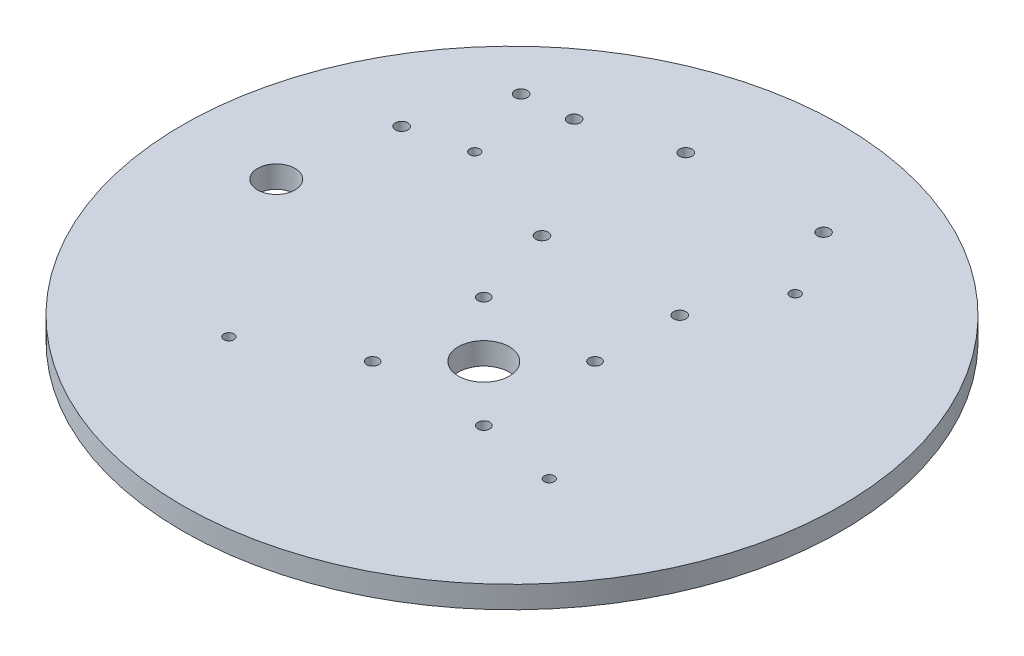
ISO-10303-21;
HEADER;
FILE_DESCRIPTION(('STEP AP214'),'2;1');
FILE_NAME('part.step','',(''),(''),'','','');
FILE_SCHEMA(('AUTOMOTIVE_DESIGN { 1 0 10303 214 1 1 1 1 }'));
ENDSEC;
DATA;
#1=APPLICATION_CONTEXT('core data for automotive mechanical design processes');
#2=APPLICATION_PROTOCOL_DEFINITION('international standard','automotive_design',2000,#1);
#3=PRODUCT_CONTEXT('',#1,'mechanical');
#4=PRODUCT('Part','Part','',(#3));
#5=PRODUCT_RELATED_PRODUCT_CATEGORY('part','',(#4));
#6=PRODUCT_DEFINITION_FORMATION('','',#4);
#7=PRODUCT_DEFINITION_CONTEXT('part definition',#1,'design');
#8=PRODUCT_DEFINITION('design','',#6,#7);
#9=PRODUCT_DEFINITION_SHAPE('','',#8);
#10=(LENGTH_UNIT() NAMED_UNIT(*) SI_UNIT(.MILLI.,.METRE.));
#11=(NAMED_UNIT(*) PLANE_ANGLE_UNIT() SI_UNIT($,.RADIAN.));
#12=(NAMED_UNIT(*) SI_UNIT($,.STERADIAN.) SOLID_ANGLE_UNIT());
#13=UNCERTAINTY_MEASURE_WITH_UNIT(LENGTH_MEASURE(1.E-05),#10,'distance_accuracy_value','');
#14=(GEOMETRIC_REPRESENTATION_CONTEXT(3) GLOBAL_UNCERTAINTY_ASSIGNED_CONTEXT((#13)) GLOBAL_UNIT_ASSIGNED_CONTEXT((#10,
#11,#12)) REPRESENTATION_CONTEXT('',''));
#15=CARTESIAN_POINT('',(0.,0.,0.));
#16=DIRECTION('',(0.,0.,1.));
#17=DIRECTION('',(1.,0.,0.));
#18=AXIS2_PLACEMENT_3D('',#15,#16,#17);
#19=CARTESIAN_POINT('',(0.,-3.,0.));
#20=DIRECTION('',(0.,-1.,0.));
#21=DIRECTION('',(0.,0.,-1.));
#22=AXIS2_PLACEMENT_3D('',#19,#20,#21);
#23=PLANE('',#22);
#24=CARTESIAN_POINT('',(-79.3222983177107,-3.,-83.1746789269192));
#25=DIRECTION('',(0.,-1.,0.));
#26=DIRECTION('',(0.,0.,-1.));
#27=AXIS2_PLACEMENT_3D('',#24,#25,#26);
#28=CIRCLE('',#27,6.12);
#29=CARTESIAN_POINT('',(-79.3222983177107,-3.,-89.2946789269192));
#30=VERTEX_POINT('',#29);
#31=EDGE_CURVE('E176',#30,#30,#28,.T.);
#32=ORIENTED_EDGE('',*,*,#31,.F.);
#33=EDGE_LOOP('',(#32));
#34=FACE_BOUND('',#33,.T.);
#35=CARTESIAN_POINT('',(-92.744292939751,-3.,-45.9541200775911));
#36=DIRECTION('',(0.,-1.,0.));
#37=DIRECTION('',(0.,0.,-1.));
#38=AXIS2_PLACEMENT_3D('',#35,#36,#37);
#39=CIRCLE('',#38,6.12);
#40=CARTESIAN_POINT('',(-92.744292939751,-3.,-52.0741200775911));
#41=VERTEX_POINT('',#40);
#42=EDGE_CURVE('E164',#41,#41,#39,.T.);
#43=ORIENTED_EDGE('',*,*,#42,.F.);
#44=EDGE_LOOP('',(#43));
#45=FACE_BOUND('',#44,.T.);
#46=CARTESIAN_POINT('',(-58.8369868262449,-3.,-85.1557044842463));
#47=DIRECTION('',(0.,-1.,0.));
#48=DIRECTION('',(0.,0.,-1.));
#49=AXIS2_PLACEMENT_3D('',#46,#47,#48);
#50=CIRCLE('',#49,6.11999999999999);
#51=CARTESIAN_POINT('',(-58.8369868262449,-3.,-91.2757044842463));
#52=VERTEX_POINT('',#51);
#53=EDGE_CURVE('E152',#52,#52,#50,.T.);
#54=ORIENTED_EDGE('',*,*,#53,.F.);
#55=EDGE_LOOP('',(#54));
#56=FACE_BOUND('',#55,.T.);
#57=CARTESIAN_POINT('',(35.56,-3.,-96.52));
#58=DIRECTION('',(0.,-1.,0.));
#59=DIRECTION('',(0.,0.,-1.));
#60=AXIS2_PLACEMENT_3D('',#57,#58,#59);
#61=CIRCLE('',#60,5.855);
#62=CARTESIAN_POINT('',(35.56,-3.,-102.375));
#63=VERTEX_POINT('',#62);
#64=EDGE_CURVE('E140',#63,#63,#61,.T.);
#65=ORIENTED_EDGE('',*,*,#64,.F.);
#66=EDGE_LOOP('',(#65));
#67=FACE_BOUND('',#66,.T.);
#68=CARTESIAN_POINT('',(35.56,-3.,-35.56));
#69=DIRECTION('',(0.,-1.,0.));
#70=DIRECTION('',(0.,0.,-1.));
#71=AXIS2_PLACEMENT_3D('',#68,#69,#70);
#72=CIRCLE('',#71,5.855);
#73=CARTESIAN_POINT('',(35.56,-3.,-41.415));
#74=VERTEX_POINT('',#73);
#75=EDGE_CURVE('E128',#74,#74,#72,.T.);
#76=ORIENTED_EDGE('',*,*,#75,.F.);
#77=EDGE_LOOP('',(#76));
#78=FACE_BOUND('',#77,.T.);
#79=CARTESIAN_POINT('',(-22.86,-3.,-35.56));
#80=DIRECTION('',(0.,-1.,0.));
#81=DIRECTION('',(0.,0.,-1.));
#82=AXIS2_PLACEMENT_3D('',#79,#80,#81);
#83=CIRCLE('',#82,5.855);
#84=CARTESIAN_POINT('',(-22.86,-3.,-41.415));
#85=VERTEX_POINT('',#84);
#86=EDGE_CURVE('E116',#85,#85,#83,.T.);
#87=ORIENTED_EDGE('',*,*,#86,.F.);
#88=EDGE_LOOP('',(#87));
#89=FACE_BOUND('',#88,.T.);
#90=CARTESIAN_POINT('',(-22.86,-3.,-96.52));
#91=DIRECTION('',(0.,-1.,0.));
#92=DIRECTION('',(0.,0.,-1.));
#93=AXIS2_PLACEMENT_3D('',#90,#91,#92);
#94=CIRCLE('',#93,5.855);
#95=CARTESIAN_POINT('',(-22.86,-3.,-102.375));
#96=VERTEX_POINT('',#95);
#97=EDGE_CURVE('E104',#96,#96,#94,.T.);
#98=ORIENTED_EDGE('',*,*,#97,.F.);
#99=EDGE_LOOP('',(#98));
#100=FACE_BOUND('',#99,.T.);
#101=CARTESIAN_POINT('',(10.9599733313389,-3.,22.9137291721872));
#102=DIRECTION('',(0.,-1.,0.));
#103=DIRECTION('',(0.,0.,-1.));
#104=AXIS2_PLACEMENT_3D('',#101,#102,#103);
#105=CIRCLE('',#104,10.795);
#106=CARTESIAN_POINT('',(10.9599733313389,-3.,12.1187291721872));
#107=VERTEX_POINT('',#106);
#108=EDGE_CURVE('E73',#107,#107,#105,.T.);
#109=ORIENTED_EDGE('',*,*,#108,.F.);
#110=EDGE_LOOP('',(#109));
#111=FACE_BOUND('',#110,.T.);
#112=CARTESIAN_POINT('',(34.5299733313389,-3.,-0.656270827812819));
#113=DIRECTION('',(0.,1.,0.));
#114=DIRECTION('',(0.,0.,1.));
#115=AXIS2_PLACEMENT_3D('',#112,#113,#114);
#116=CIRCLE('',#115,2.49999999999999);
#117=CARTESIAN_POINT('',(34.5299733313389,-3.,1.84372917218718));
#118=VERTEX_POINT('',#117);
#119=EDGE_CURVE('E72',#118,#118,#116,.T.);
#120=ORIENTED_EDGE('',*,*,#119,.T.);
#121=EDGE_LOOP('',(#120));
#122=FACE_BOUND('',#121,.T.);
#123=CARTESIAN_POINT('',(-12.6100266686612,-3.,-0.656270827812819));
#124=DIRECTION('',(0.,1.,0.));
#125=DIRECTION('',(0.,0.,1.));
#126=AXIS2_PLACEMENT_3D('',#123,#124,#125);
#127=CIRCLE('',#126,2.5);
#128=CARTESIAN_POINT('',(-12.6100266686612,-3.,1.84372917218718));
#129=VERTEX_POINT('',#128);
#130=EDGE_CURVE('E79',#129,#129,#127,.T.);
#131=ORIENTED_EDGE('',*,*,#130,.T.);
#132=EDGE_LOOP('',(#131));
#133=FACE_BOUND('',#132,.T.);
#134=CARTESIAN_POINT('',(-12.6100266686612,-3.,46.4837291721872));
#135=DIRECTION('',(0.,1.,0.));
#136=DIRECTION('',(0.,0.,1.));
#137=AXIS2_PLACEMENT_3D('',#134,#135,#136);
#138=CIRCLE('',#137,2.5);
#139=CARTESIAN_POINT('',(-12.6100266686612,-3.,48.9837291721872));
#140=VERTEX_POINT('',#139);
#141=EDGE_CURVE('E85',#140,#140,#138,.T.);
#142=ORIENTED_EDGE('',*,*,#141,.T.);
#143=EDGE_LOOP('',(#142));
#144=FACE_BOUND('',#143,.T.);
#145=CARTESIAN_POINT('',(34.5299733313389,-3.,46.4837291721872));
#146=DIRECTION('',(0.,1.,0.));
#147=DIRECTION('',(0.,0.,1.));
#148=AXIS2_PLACEMENT_3D('',#145,#146,#147);
#149=CIRCLE('',#148,2.5);
#150=CARTESIAN_POINT('',(34.5299733313389,-3.,48.9837291721872));
#151=VERTEX_POINT('',#150);
#152=EDGE_CURVE('E68',#151,#151,#149,.T.);
#153=ORIENTED_EDGE('',*,*,#152,.T.);
#154=EDGE_LOOP('',(#153));
#155=FACE_BOUND('',#154,.T.);
#156=CARTESIAN_POINT('',(-99.9143296030154,-3.,0.));
#157=DIRECTION('',(0.,1.,0.));
#158=DIRECTION('',(0.,0.,1.));
#159=AXIS2_PLACEMENT_3D('',#156,#157,#158);
#160=CIRCLE('',#159,7.9375);
#161=CARTESIAN_POINT('',(-99.9143296030154,-3.,7.9375));
#162=VERTEX_POINT('',#161);
#163=EDGE_CURVE('E59',#162,#162,#160,.T.);
#164=ORIENTED_EDGE('',*,*,#163,.T.);
#165=EDGE_LOOP('',(#164));
#166=FACE_BOUND('',#165,.T.);
#167=CARTESIAN_POINT('',(67.9108883435695,-3.,52.1098574036457));
#168=DIRECTION('',(0.,1.,0.));
#169=DIRECTION('',(0.,0.,1.));
#170=AXIS2_PLACEMENT_3D('',#167,#168,#169);
#171=CIRCLE('',#170,2.15);
#172=CARTESIAN_POINT('',(67.9108883435695,-3.,54.2598574036457));
#173=VERTEX_POINT('',#172);
#174=EDGE_CURVE('E56',#173,#173,#171,.T.);
#175=ORIENTED_EDGE('',*,*,#174,.T.);
#176=EDGE_LOOP('',(#175));
#177=FACE_BOUND('',#176,.T.);
#178=CARTESIAN_POINT('',(-52.1098574036464,-3.,67.910888343569));
#179=DIRECTION('',(0.,1.,0.));
#180=DIRECTION('',(0.,0.,1.));
#181=AXIS2_PLACEMENT_3D('',#178,#179,#180);
#182=CIRCLE('',#181,2.15);
#183=CARTESIAN_POINT('',(-52.1098574036464,-3.,70.060888343569));
#184=VERTEX_POINT('',#183);
#185=EDGE_CURVE('E51',#184,#184,#182,.T.);
#186=ORIENTED_EDGE('',*,*,#185,.T.);
#187=EDGE_LOOP('',(#186));
#188=FACE_BOUND('',#187,.T.);
#189=CARTESIAN_POINT('',(-67.9108883435691,-3.,-52.1098574036462));
#190=DIRECTION('',(0.,1.,0.));
#191=DIRECTION('',(0.,0.,1.));
#192=AXIS2_PLACEMENT_3D('',#189,#190,#191);
#193=CIRCLE('',#192,2.15);
#194=CARTESIAN_POINT('',(-67.9108883435691,-3.,-49.9598574036462));
#195=VERTEX_POINT('',#194);
#196=EDGE_CURVE('E47',#195,#195,#193,.T.);
#197=ORIENTED_EDGE('',*,*,#196,.T.);
#198=EDGE_LOOP('',(#197));
#199=FACE_BOUND('',#198,.T.);
#200=CARTESIAN_POINT('',(52.1098574036464,-3.,-67.910888343569));
#201=DIRECTION('',(0.,1.,0.));
#202=DIRECTION('',(0.,0.,1.));
#203=AXIS2_PLACEMENT_3D('',#200,#201,#202);
#204=CIRCLE('',#203,2.15);
#205=CARTESIAN_POINT('',(52.1098574036464,-3.,-65.760888343569));
#206=VERTEX_POINT('',#205);
#207=EDGE_CURVE('E43',#206,#206,#204,.T.);
#208=ORIENTED_EDGE('',*,*,#207,.T.);
#209=EDGE_LOOP('',(#208));
#210=FACE_BOUND('',#209,.T.);
#211=CARTESIAN_POINT('',(0.,-3.,0.));
#212=DIRECTION('',(0.,-1.,0.));
#213=DIRECTION('',(0.,0.,-1.));
#214=AXIS2_PLACEMENT_3D('',#211,#212,#213);
#215=CIRCLE('',#214,139.7);
#216=CARTESIAN_POINT('',(0.,-3.,-139.7));
#217=VERTEX_POINT('',#216);
#218=EDGE_CURVE('E65',#217,#217,#215,.T.);
#219=ORIENTED_EDGE('',*,*,#218,.T.);
#220=EDGE_LOOP('',(#219));
#221=FACE_BOUND('',#220,.T.);
#222=ADVANCED_FACE('F36',(#34,#45,#56,#67,#78,#89,#100,#111,#122,#133,#144,#155,#166,#177,#188,
#199,#210,#221),#23,.T.);
#223=CARTESIAN_POINT('',(0.,6.35,0.));
#224=DIRECTION('',(0.,1.,0.));
#225=DIRECTION('',(0.,0.,1.));
#226=AXIS2_PLACEMENT_3D('',#223,#224,#225);
#227=PLANE('',#226);
#228=CARTESIAN_POINT('',(-79.3222983177107,6.35,-83.1746789269192));
#229=DIRECTION('',(0.,-1.,0.));
#230=DIRECTION('',(0.,0.,-1.));
#231=AXIS2_PLACEMENT_3D('',#228,#229,#230);
#232=CIRCLE('',#231,2.65);
#233=CARTESIAN_POINT('',(-79.3222983177107,6.35,-85.8246789269192));
#234=VERTEX_POINT('',#233);
#235=EDGE_CURVE('E167',#234,#234,#232,.T.);
#236=ORIENTED_EDGE('',*,*,#235,.T.);
#237=EDGE_LOOP('',(#236));
#238=FACE_BOUND('',#237,.T.);
#239=CARTESIAN_POINT('',(-92.744292939751,6.35,-45.9541200775911));
#240=DIRECTION('',(0.,-1.,0.));
#241=DIRECTION('',(0.,0.,-1.));
#242=AXIS2_PLACEMENT_3D('',#239,#240,#241);
#243=CIRCLE('',#242,2.65);
#244=CARTESIAN_POINT('',(-92.744292939751,6.35,-48.6041200775911));
#245=VERTEX_POINT('',#244);
#246=EDGE_CURVE('E155',#245,#245,#243,.T.);
#247=ORIENTED_EDGE('',*,*,#246,.T.);
#248=EDGE_LOOP('',(#247));
#249=FACE_BOUND('',#248,.T.);
#250=CARTESIAN_POINT('',(-58.8369868262449,6.35,-85.1557044842463));
#251=DIRECTION('',(0.,-1.,0.));
#252=DIRECTION('',(0.,0.,-1.));
#253=AXIS2_PLACEMENT_3D('',#250,#251,#252);
#254=CIRCLE('',#253,2.65);
#255=CARTESIAN_POINT('',(-58.8369868262449,6.35,-87.8057044842463));
#256=VERTEX_POINT('',#255);
#257=EDGE_CURVE('E143',#256,#256,#254,.T.);
#258=ORIENTED_EDGE('',*,*,#257,.T.);
#259=EDGE_LOOP('',(#258));
#260=FACE_BOUND('',#259,.T.);
#261=CARTESIAN_POINT('',(35.56,6.35,-96.52));
#262=DIRECTION('',(0.,-1.,0.));
#263=DIRECTION('',(0.,0.,-1.));
#264=AXIS2_PLACEMENT_3D('',#261,#262,#263);
#265=CIRCLE('',#264,2.65);
#266=CARTESIAN_POINT('',(35.56,6.35,-99.17));
#267=VERTEX_POINT('',#266);
#268=EDGE_CURVE('E131',#267,#267,#265,.T.);
#269=ORIENTED_EDGE('',*,*,#268,.T.);
#270=EDGE_LOOP('',(#269));
#271=FACE_BOUND('',#270,.T.);
#272=CARTESIAN_POINT('',(35.56,6.35,-35.56));
#273=DIRECTION('',(0.,-1.,0.));
#274=DIRECTION('',(0.,0.,-1.));
#275=AXIS2_PLACEMENT_3D('',#272,#273,#274);
#276=CIRCLE('',#275,2.65);
#277=CARTESIAN_POINT('',(35.56,6.35,-38.21));
#278=VERTEX_POINT('',#277);
#279=EDGE_CURVE('E119',#278,#278,#276,.T.);
#280=ORIENTED_EDGE('',*,*,#279,.T.);
#281=EDGE_LOOP('',(#280));
#282=FACE_BOUND('',#281,.T.);
#283=CARTESIAN_POINT('',(-22.86,6.35,-35.56));
#284=DIRECTION('',(0.,-1.,0.));
#285=DIRECTION('',(0.,0.,-1.));
#286=AXIS2_PLACEMENT_3D('',#283,#284,#285);
#287=CIRCLE('',#286,2.65);
#288=CARTESIAN_POINT('',(-22.86,6.35,-38.21));
#289=VERTEX_POINT('',#288);
#290=EDGE_CURVE('E107',#289,#289,#287,.T.);
#291=ORIENTED_EDGE('',*,*,#290,.T.);
#292=EDGE_LOOP('',(#291));
#293=FACE_BOUND('',#292,.T.);
#294=CARTESIAN_POINT('',(-22.86,6.35,-96.52));
#295=DIRECTION('',(0.,-1.,0.));
#296=DIRECTION('',(0.,0.,-1.));
#297=AXIS2_PLACEMENT_3D('',#294,#295,#296);
#298=CIRCLE('',#297,2.65);
#299=CARTESIAN_POINT('',(-22.86,6.35,-99.17));
#300=VERTEX_POINT('',#299);
#301=EDGE_CURVE('E95',#300,#300,#298,.T.);
#302=ORIENTED_EDGE('',*,*,#301,.T.);
#303=EDGE_LOOP('',(#302));
#304=FACE_BOUND('',#303,.T.);
#305=CARTESIAN_POINT('',(34.5299733313389,6.35,-0.656270827812819));
#306=DIRECTION('',(0.,1.,0.));
#307=DIRECTION('',(0.,0.,1.));
#308=AXIS2_PLACEMENT_3D('',#305,#306,#307);
#309=CIRCLE('',#308,2.49999999999999);
#310=CARTESIAN_POINT('',(34.5299733313389,6.35,1.84372917218718));
#311=VERTEX_POINT('',#310);
#312=EDGE_CURVE('E69',#311,#311,#309,.T.);
#313=ORIENTED_EDGE('',*,*,#312,.F.);
#314=EDGE_LOOP('',(#313));
#315=FACE_BOUND('',#314,.T.);
#316=CARTESIAN_POINT('',(-12.6100266686612,6.35,-0.656270827812819));
#317=DIRECTION('',(0.,1.,0.));
#318=DIRECTION('',(0.,0.,1.));
#319=AXIS2_PLACEMENT_3D('',#316,#317,#318);
#320=CIRCLE('',#319,2.5);
#321=CARTESIAN_POINT('',(-12.6100266686612,6.35,1.84372917218718));
#322=VERTEX_POINT('',#321);
#323=EDGE_CURVE('E76',#322,#322,#320,.T.);
#324=ORIENTED_EDGE('',*,*,#323,.F.);
#325=EDGE_LOOP('',(#324));
#326=FACE_BOUND('',#325,.T.);
#327=CARTESIAN_POINT('',(-12.6100266686612,6.35,46.4837291721872));
#328=DIRECTION('',(0.,1.,0.));
#329=DIRECTION('',(0.,0.,1.));
#330=AXIS2_PLACEMENT_3D('',#327,#328,#329);
#331=CIRCLE('',#330,2.5);
#332=CARTESIAN_POINT('',(-12.6100266686612,6.35,48.9837291721872));
#333=VERTEX_POINT('',#332);
#334=EDGE_CURVE('E82',#333,#333,#331,.T.);
#335=ORIENTED_EDGE('',*,*,#334,.F.);
#336=EDGE_LOOP('',(#335));
#337=FACE_BOUND('',#336,.T.);
#338=CARTESIAN_POINT('',(34.5299733313389,6.35,46.4837291721872));
#339=DIRECTION('',(0.,1.,0.));
#340=DIRECTION('',(0.,0.,1.));
#341=AXIS2_PLACEMENT_3D('',#338,#339,#340);
#342=CIRCLE('',#341,2.5);
#343=CARTESIAN_POINT('',(34.5299733313389,6.35,48.9837291721872));
#344=VERTEX_POINT('',#343);
#345=EDGE_CURVE('E88',#344,#344,#342,.T.);
#346=ORIENTED_EDGE('',*,*,#345,.F.);
#347=EDGE_LOOP('',(#346));
#348=FACE_BOUND('',#347,.T.);
#349=CARTESIAN_POINT('',(-99.9143296030154,6.35,0.));
#350=DIRECTION('',(0.,1.,0.));
#351=DIRECTION('',(0.,0.,1.));
#352=AXIS2_PLACEMENT_3D('',#349,#350,#351);
#353=CIRCLE('',#352,7.9375);
#354=CARTESIAN_POINT('',(-99.9143296030154,6.35,7.9375));
#355=VERTEX_POINT('',#354);
#356=EDGE_CURVE('E62',#355,#355,#353,.T.);
#357=ORIENTED_EDGE('',*,*,#356,.F.);
#358=EDGE_LOOP('',(#357));
#359=FACE_BOUND('',#358,.T.);
#360=CARTESIAN_POINT('',(0.,6.35,0.));
#361=DIRECTION('',(0.,1.,0.));
#362=DIRECTION('',(0.,0.,1.));
#363=AXIS2_PLACEMENT_3D('',#360,#361,#362);
#364=CIRCLE('',#363,139.7);
#365=CARTESIAN_POINT('',(0.,6.35,139.7));
#366=VERTEX_POINT('',#365);
#367=EDGE_CURVE('E10',#366,#366,#364,.T.);
#368=ORIENTED_EDGE('',*,*,#367,.T.);
#369=EDGE_LOOP('',(#368));
#370=FACE_BOUND('',#369,.T.);
#371=CARTESIAN_POINT('',(-52.1098574036464,6.35,67.910888343569));
#372=DIRECTION('',(0.,1.,0.));
#373=DIRECTION('',(0.,0.,1.));
#374=AXIS2_PLACEMENT_3D('',#371,#372,#373);
#375=CIRCLE('',#374,2.15);
#376=CARTESIAN_POINT('',(-52.1098574036464,6.35,70.060888343569));
#377=VERTEX_POINT('',#376);
#378=EDGE_CURVE('E179',#377,#377,#375,.T.);
#379=ORIENTED_EDGE('',*,*,#378,.F.);
#380=EDGE_LOOP('',(#379));
#381=FACE_BOUND('',#380,.T.);
#382=CARTESIAN_POINT('',(67.9108883435695,6.35,52.1098574036457));
#383=DIRECTION('',(0.,1.,0.));
#384=DIRECTION('',(0.,0.,1.));
#385=AXIS2_PLACEMENT_3D('',#382,#383,#384);
#386=CIRCLE('',#385,2.15);
#387=CARTESIAN_POINT('',(67.9108883435695,6.35,54.2598574036457));
#388=VERTEX_POINT('',#387);
#389=EDGE_CURVE('E182',#388,#388,#386,.T.);
#390=ORIENTED_EDGE('',*,*,#389,.F.);
#391=EDGE_LOOP('',(#390));
#392=FACE_BOUND('',#391,.T.);
#393=CARTESIAN_POINT('',(10.9599733313389,6.35,22.9137291721872));
#394=DIRECTION('',(0.,1.,0.));
#395=DIRECTION('',(0.,0.,1.));
#396=AXIS2_PLACEMENT_3D('',#393,#394,#395);
#397=CIRCLE('',#396,10.795);
#398=CARTESIAN_POINT('',(10.9599733313389,6.35,33.7087291721872));
#399=VERTEX_POINT('',#398);
#400=EDGE_CURVE('E185',#399,#399,#397,.T.);
#401=ORIENTED_EDGE('',*,*,#400,.F.);
#402=EDGE_LOOP('',(#401));
#403=FACE_BOUND('',#402,.T.);
#404=CARTESIAN_POINT('',(52.1098574036464,6.35,-67.910888343569));
#405=DIRECTION('',(0.,1.,0.));
#406=DIRECTION('',(0.,0.,1.));
#407=AXIS2_PLACEMENT_3D('',#404,#405,#406);
#408=CIRCLE('',#407,2.15);
#409=CARTESIAN_POINT('',(52.1098574036464,6.35,-65.760888343569));
#410=VERTEX_POINT('',#409);
#411=EDGE_CURVE('E188',#410,#410,#408,.T.);
#412=ORIENTED_EDGE('',*,*,#411,.F.);
#413=EDGE_LOOP('',(#412));
#414=FACE_BOUND('',#413,.T.);
#415=CARTESIAN_POINT('',(-67.9108883435691,6.35,-52.1098574036462));
#416=DIRECTION('',(0.,1.,0.));
#417=DIRECTION('',(0.,0.,1.));
#418=AXIS2_PLACEMENT_3D('',#415,#416,#417);
#419=CIRCLE('',#418,2.15);
#420=CARTESIAN_POINT('',(-67.9108883435691,6.35,-49.9598574036462));
#421=VERTEX_POINT('',#420);
#422=EDGE_CURVE('E191',#421,#421,#419,.T.);
#423=ORIENTED_EDGE('',*,*,#422,.F.);
#424=EDGE_LOOP('',(#423));
#425=FACE_BOUND('',#424,.T.);
#426=ADVANCED_FACE('F197',(#238,#249,#260,#271,#282,#293,#304,#315,#326,#337,#348,#359,#370,
#381,#392,#403,#414,#425),#227,.T.);
#427=CARTESIAN_POINT('',(0.,6.35,0.));
#428=DIRECTION('',(0.,-1.,0.));
#429=DIRECTION('',(0.,0.,-1.));
#430=AXIS2_PLACEMENT_3D('',#427,#428,#429);
#431=CYLINDRICAL_SURFACE('',#430,139.7);
#432=ORIENTED_EDGE('',*,*,#367,.F.);
#433=EDGE_LOOP('',(#432));
#434=FACE_BOUND('',#433,.T.);
#435=ORIENTED_EDGE('',*,*,#218,.F.);
#436=EDGE_LOOP('',(#435));
#437=FACE_BOUND('',#436,.T.);
#438=ADVANCED_FACE('F38',(#434,#437),#431,.T.);
#439=CARTESIAN_POINT('',(52.1098574036464,6.35,-67.910888343569));
#440=DIRECTION('',(0.,1.,0.));
#441=DIRECTION('',(0.,0.,1.));
#442=AXIS2_PLACEMENT_3D('',#439,#440,#441);
#443=CYLINDRICAL_SURFACE('',#442,2.15);
#444=ORIENTED_EDGE('',*,*,#207,.F.);
#445=EDGE_LOOP('',(#444));
#446=FACE_BOUND('',#445,.T.);
#447=ORIENTED_EDGE('',*,*,#411,.T.);
#448=EDGE_LOOP('',(#447));
#449=FACE_BOUND('',#448,.T.);
#450=ADVANCED_FACE('F204',(#446,#449),#443,.F.);
#451=CARTESIAN_POINT('',(-67.9108883435691,6.35,-52.1098574036462));
#452=DIRECTION('',(0.,1.,0.));
#453=DIRECTION('',(0.,0.,1.));
#454=AXIS2_PLACEMENT_3D('',#451,#452,#453);
#455=CYLINDRICAL_SURFACE('',#454,2.15);
#456=ORIENTED_EDGE('',*,*,#196,.F.);
#457=EDGE_LOOP('',(#456));
#458=FACE_BOUND('',#457,.T.);
#459=ORIENTED_EDGE('',*,*,#422,.T.);
#460=EDGE_LOOP('',(#459));
#461=FACE_BOUND('',#460,.T.);
#462=ADVANCED_FACE('F195',(#458,#461),#455,.F.);
#463=CARTESIAN_POINT('',(-52.1098574036464,6.35,67.910888343569));
#464=DIRECTION('',(0.,1.,0.));
#465=DIRECTION('',(0.,0.,1.));
#466=AXIS2_PLACEMENT_3D('',#463,#464,#465);
#467=CYLINDRICAL_SURFACE('',#466,2.15);
#468=ORIENTED_EDGE('',*,*,#185,.F.);
#469=EDGE_LOOP('',(#468));
#470=FACE_BOUND('',#469,.T.);
#471=ORIENTED_EDGE('',*,*,#378,.T.);
#472=EDGE_LOOP('',(#471));
#473=FACE_BOUND('',#472,.T.);
#474=ADVANCED_FACE('F215',(#470,#473),#467,.F.);
#475=CARTESIAN_POINT('',(67.9108883435695,6.35,52.1098574036457));
#476=DIRECTION('',(0.,1.,0.));
#477=DIRECTION('',(0.,0.,1.));
#478=AXIS2_PLACEMENT_3D('',#475,#476,#477);
#479=CYLINDRICAL_SURFACE('',#478,2.15);
#480=ORIENTED_EDGE('',*,*,#174,.F.);
#481=EDGE_LOOP('',(#480));
#482=FACE_BOUND('',#481,.T.);
#483=ORIENTED_EDGE('',*,*,#389,.T.);
#484=EDGE_LOOP('',(#483));
#485=FACE_BOUND('',#484,.T.);
#486=ADVANCED_FACE('F219',(#482,#485),#479,.F.);
#487=CARTESIAN_POINT('',(-99.9143296030154,6.35,0.));
#488=DIRECTION('',(0.,1.,0.));
#489=DIRECTION('',(0.,0.,1.));
#490=AXIS2_PLACEMENT_3D('',#487,#488,#489);
#491=CYLINDRICAL_SURFACE('',#490,7.9375);
#492=ORIENTED_EDGE('',*,*,#163,.F.);
#493=EDGE_LOOP('',(#492));
#494=FACE_BOUND('',#493,.T.);
#495=ORIENTED_EDGE('',*,*,#356,.T.);
#496=EDGE_LOOP('',(#495));
#497=FACE_BOUND('',#496,.T.);
#498=ADVANCED_FACE('F223',(#494,#497),#491,.F.);
#499=CARTESIAN_POINT('',(34.5299733313389,-3.,46.4837291721872));
#500=DIRECTION('',(0.,1.,0.));
#501=DIRECTION('',(0.,0.,1.));
#502=AXIS2_PLACEMENT_3D('',#499,#500,#501);
#503=CYLINDRICAL_SURFACE('',#502,2.5);
#504=ORIENTED_EDGE('',*,*,#152,.F.);
#505=EDGE_LOOP('',(#504));
#506=FACE_BOUND('',#505,.T.);
#507=ORIENTED_EDGE('',*,*,#345,.T.);
#508=EDGE_LOOP('',(#507));
#509=FACE_BOUND('',#508,.T.);
#510=ADVANCED_FACE('F227',(#506,#509),#503,.F.);
#511=CARTESIAN_POINT('',(-12.6100266686612,-3.,46.4837291721872));
#512=DIRECTION('',(0.,1.,0.));
#513=DIRECTION('',(0.,0.,1.));
#514=AXIS2_PLACEMENT_3D('',#511,#512,#513);
#515=CYLINDRICAL_SURFACE('',#514,2.5);
#516=ORIENTED_EDGE('',*,*,#141,.F.);
#517=EDGE_LOOP('',(#516));
#518=FACE_BOUND('',#517,.T.);
#519=ORIENTED_EDGE('',*,*,#334,.T.);
#520=EDGE_LOOP('',(#519));
#521=FACE_BOUND('',#520,.T.);
#522=ADVANCED_FACE('F237',(#518,#521),#515,.F.);
#523=CARTESIAN_POINT('',(-12.6100266686612,-3.,-0.656270827812819));
#524=DIRECTION('',(0.,1.,0.));
#525=DIRECTION('',(0.,0.,1.));
#526=AXIS2_PLACEMENT_3D('',#523,#524,#525);
#527=CYLINDRICAL_SURFACE('',#526,2.5);
#528=ORIENTED_EDGE('',*,*,#130,.F.);
#529=EDGE_LOOP('',(#528));
#530=FACE_BOUND('',#529,.T.);
#531=ORIENTED_EDGE('',*,*,#323,.T.);
#532=EDGE_LOOP('',(#531));
#533=FACE_BOUND('',#532,.T.);
#534=ADVANCED_FACE('F233',(#530,#533),#527,.F.);
#535=CARTESIAN_POINT('',(34.5299733313389,-3.,-0.656270827812819));
#536=DIRECTION('',(0.,1.,0.));
#537=DIRECTION('',(0.,0.,1.));
#538=AXIS2_PLACEMENT_3D('',#535,#536,#537);
#539=CYLINDRICAL_SURFACE('',#538,2.49999999999999);
#540=ORIENTED_EDGE('',*,*,#119,.F.);
#541=EDGE_LOOP('',(#540));
#542=FACE_BOUND('',#541,.T.);
#543=ORIENTED_EDGE('',*,*,#312,.T.);
#544=EDGE_LOOP('',(#543));
#545=FACE_BOUND('',#544,.T.);
#546=ADVANCED_FACE('F229',(#542,#545),#539,.F.);
#547=CARTESIAN_POINT('',(10.9599733313389,6.35,22.9137291721872));
#548=DIRECTION('',(0.,-1.,0.));
#549=DIRECTION('',(0.,0.,-1.));
#550=AXIS2_PLACEMENT_3D('',#547,#548,#549);
#551=CYLINDRICAL_SURFACE('',#550,10.795);
#552=ORIENTED_EDGE('',*,*,#108,.T.);
#553=EDGE_LOOP('',(#552));
#554=FACE_BOUND('',#553,.T.);
#555=ORIENTED_EDGE('',*,*,#400,.T.);
#556=EDGE_LOOP('',(#555));
#557=FACE_BOUND('',#556,.T.);
#558=ADVANCED_FACE('F232',(#554,#557),#551,.F.);
#559=CARTESIAN_POINT('',(-22.86,-3.,-96.52));
#560=DIRECTION('',(0.,-1.,0.));
#561=DIRECTION('',(0.,0.,-1.));
#562=AXIS2_PLACEMENT_3D('',#559,#560,#561);
#563=CYLINDRICAL_SURFACE('',#562,2.65);
#564=ORIENTED_EDGE('',*,*,#301,.F.);
#565=EDGE_LOOP('',(#564));
#566=FACE_BOUND('',#565,.T.);
#567=CARTESIAN_POINT('',(-22.86,0.799999999999999,-96.52));
#568=DIRECTION('',(0.,-1.,0.));
#569=DIRECTION('',(0.,0.,-1.));
#570=AXIS2_PLACEMENT_3D('',#567,#568,#569);
#571=CIRCLE('',#570,2.65);
#572=CARTESIAN_POINT('',(-22.86,0.799999999999999,-99.17));
#573=VERTEX_POINT('',#572);
#574=EDGE_CURVE('E98',#573,#573,#571,.T.);
#575=ORIENTED_EDGE('',*,*,#574,.T.);
#576=EDGE_LOOP('',(#575));
#577=FACE_BOUND('',#576,.T.);
#578=ADVANCED_FACE('F247',(#566,#577),#563,.F.);
#579=CARTESIAN_POINT('',(-20.21,0.8,-96.52));
#580=DIRECTION('',(0.,1.,0.));
#581=DIRECTION('',(0.,0.,1.));
#582=AXIS2_PLACEMENT_3D('',#579,#580,#581);
#583=PLANE('',#582);
#584=ORIENTED_EDGE('',*,*,#574,.F.);
#585=EDGE_LOOP('',(#584));
#586=FACE_BOUND('',#585,.T.);
#587=CARTESIAN_POINT('',(-22.86,0.800000000000001,-96.52));
#588=DIRECTION('',(0.,-1.,0.));
#589=DIRECTION('',(0.,0.,-1.));
#590=AXIS2_PLACEMENT_3D('',#587,#588,#589);
#591=CIRCLE('',#590,5.855);
#592=CARTESIAN_POINT('',(-22.86,0.800000000000001,-102.375));
#593=VERTEX_POINT('',#592);
#594=EDGE_CURVE('E101',#593,#593,#591,.T.);
#595=ORIENTED_EDGE('',*,*,#594,.T.);
#596=EDGE_LOOP('',(#595));
#597=FACE_BOUND('',#596,.T.);
#598=ADVANCED_FACE('F251',(#586,#597),#583,.F.);
#599=CARTESIAN_POINT('',(-22.86,-3.,-96.52));
#600=DIRECTION('',(0.,-1.,0.));
#601=DIRECTION('',(0.,0.,-1.));
#602=AXIS2_PLACEMENT_3D('',#599,#600,#601);
#603=CYLINDRICAL_SURFACE('',#602,5.855);
#604=ORIENTED_EDGE('',*,*,#594,.F.);
#605=EDGE_LOOP('',(#604));
#606=FACE_BOUND('',#605,.T.);
#607=ORIENTED_EDGE('',*,*,#97,.T.);
#608=EDGE_LOOP('',(#607));
#609=FACE_BOUND('',#608,.T.);
#610=ADVANCED_FACE('F255',(#606,#609),#603,.F.);
#611=CARTESIAN_POINT('',(-22.86,-3.,-35.56));
#612=DIRECTION('',(0.,-1.,0.));
#613=DIRECTION('',(0.,0.,-1.));
#614=AXIS2_PLACEMENT_3D('',#611,#612,#613);
#615=CYLINDRICAL_SURFACE('',#614,2.65);
#616=ORIENTED_EDGE('',*,*,#290,.F.);
#617=EDGE_LOOP('',(#616));
#618=FACE_BOUND('',#617,.T.);
#619=CARTESIAN_POINT('',(-22.86,0.799999999999999,-35.56));
#620=DIRECTION('',(0.,-1.,0.));
#621=DIRECTION('',(0.,0.,-1.));
#622=AXIS2_PLACEMENT_3D('',#619,#620,#621);
#623=CIRCLE('',#622,2.65);
#624=CARTESIAN_POINT('',(-22.86,0.799999999999999,-38.21));
#625=VERTEX_POINT('',#624);
#626=EDGE_CURVE('E110',#625,#625,#623,.T.);
#627=ORIENTED_EDGE('',*,*,#626,.T.);
#628=EDGE_LOOP('',(#627));
#629=FACE_BOUND('',#628,.T.);
#630=ADVANCED_FACE('F259',(#618,#629),#615,.F.);
#631=CARTESIAN_POINT('',(-20.21,0.8,-35.56));
#632=DIRECTION('',(0.,1.,0.));
#633=DIRECTION('',(0.,0.,1.));
#634=AXIS2_PLACEMENT_3D('',#631,#632,#633);
#635=PLANE('',#634);
#636=ORIENTED_EDGE('',*,*,#626,.F.);
#637=EDGE_LOOP('',(#636));
#638=FACE_BOUND('',#637,.T.);
#639=CARTESIAN_POINT('',(-22.86,0.800000000000001,-35.56));
#640=DIRECTION('',(0.,-1.,0.));
#641=DIRECTION('',(0.,0.,-1.));
#642=AXIS2_PLACEMENT_3D('',#639,#640,#641);
#643=CIRCLE('',#642,5.855);
#644=CARTESIAN_POINT('',(-22.86,0.800000000000001,-41.415));
#645=VERTEX_POINT('',#644);
#646=EDGE_CURVE('E113',#645,#645,#643,.T.);
#647=ORIENTED_EDGE('',*,*,#646,.T.);
#648=EDGE_LOOP('',(#647));
#649=FACE_BOUND('',#648,.T.);
#650=ADVANCED_FACE('F263',(#638,#649),#635,.F.);
#651=CARTESIAN_POINT('',(-22.86,-3.,-35.56));
#652=DIRECTION('',(0.,-1.,0.));
#653=DIRECTION('',(0.,0.,-1.));
#654=AXIS2_PLACEMENT_3D('',#651,#652,#653);
#655=CYLINDRICAL_SURFACE('',#654,5.855);
#656=ORIENTED_EDGE('',*,*,#646,.F.);
#657=EDGE_LOOP('',(#656));
#658=FACE_BOUND('',#657,.T.);
#659=ORIENTED_EDGE('',*,*,#86,.T.);
#660=EDGE_LOOP('',(#659));
#661=FACE_BOUND('',#660,.T.);
#662=ADVANCED_FACE('F267',(#658,#661),#655,.F.);
#663=CARTESIAN_POINT('',(35.56,-3.,-35.56));
#664=DIRECTION('',(0.,-1.,0.));
#665=DIRECTION('',(0.,0.,-1.));
#666=AXIS2_PLACEMENT_3D('',#663,#664,#665);
#667=CYLINDRICAL_SURFACE('',#666,2.65);
#668=ORIENTED_EDGE('',*,*,#279,.F.);
#669=EDGE_LOOP('',(#668));
#670=FACE_BOUND('',#669,.T.);
#671=CARTESIAN_POINT('',(35.56,0.799999999999999,-35.56));
#672=DIRECTION('',(0.,-1.,0.));
#673=DIRECTION('',(0.,0.,-1.));
#674=AXIS2_PLACEMENT_3D('',#671,#672,#673);
#675=CIRCLE('',#674,2.65);
#676=CARTESIAN_POINT('',(35.56,0.799999999999999,-38.21));
#677=VERTEX_POINT('',#676);
#678=EDGE_CURVE('E122',#677,#677,#675,.T.);
#679=ORIENTED_EDGE('',*,*,#678,.T.);
#680=EDGE_LOOP('',(#679));
#681=FACE_BOUND('',#680,.T.);
#682=ADVANCED_FACE('F271',(#670,#681),#667,.F.);
#683=CARTESIAN_POINT('',(38.21,0.8,-35.56));
#684=DIRECTION('',(0.,1.,0.));
#685=DIRECTION('',(0.,0.,1.));
#686=AXIS2_PLACEMENT_3D('',#683,#684,#685);
#687=PLANE('',#686);
#688=ORIENTED_EDGE('',*,*,#678,.F.);
#689=EDGE_LOOP('',(#688));
#690=FACE_BOUND('',#689,.T.);
#691=CARTESIAN_POINT('',(35.56,0.800000000000001,-35.56));
#692=DIRECTION('',(0.,-1.,0.));
#693=DIRECTION('',(0.,0.,-1.));
#694=AXIS2_PLACEMENT_3D('',#691,#692,#693);
#695=CIRCLE('',#694,5.855);
#696=CARTESIAN_POINT('',(35.56,0.800000000000001,-41.415));
#697=VERTEX_POINT('',#696);
#698=EDGE_CURVE('E125',#697,#697,#695,.T.);
#699=ORIENTED_EDGE('',*,*,#698,.T.);
#700=EDGE_LOOP('',(#699));
#701=FACE_BOUND('',#700,.T.);
#702=ADVANCED_FACE('F275',(#690,#701),#687,.F.);
#703=CARTESIAN_POINT('',(35.56,-3.,-35.56));
#704=DIRECTION('',(0.,-1.,0.));
#705=DIRECTION('',(0.,0.,-1.));
#706=AXIS2_PLACEMENT_3D('',#703,#704,#705);
#707=CYLINDRICAL_SURFACE('',#706,5.855);
#708=ORIENTED_EDGE('',*,*,#698,.F.);
#709=EDGE_LOOP('',(#708));
#710=FACE_BOUND('',#709,.T.);
#711=ORIENTED_EDGE('',*,*,#75,.T.);
#712=EDGE_LOOP('',(#711));
#713=FACE_BOUND('',#712,.T.);
#714=ADVANCED_FACE('F279',(#710,#713),#707,.F.);
#715=CARTESIAN_POINT('',(35.56,-3.,-96.52));
#716=DIRECTION('',(0.,-1.,0.));
#717=DIRECTION('',(0.,0.,-1.));
#718=AXIS2_PLACEMENT_3D('',#715,#716,#717);
#719=CYLINDRICAL_SURFACE('',#718,2.65);
#720=ORIENTED_EDGE('',*,*,#268,.F.);
#721=EDGE_LOOP('',(#720));
#722=FACE_BOUND('',#721,.T.);
#723=CARTESIAN_POINT('',(35.56,0.799999999999999,-96.52));
#724=DIRECTION('',(0.,-1.,0.));
#725=DIRECTION('',(0.,0.,-1.));
#726=AXIS2_PLACEMENT_3D('',#723,#724,#725);
#727=CIRCLE('',#726,2.65);
#728=CARTESIAN_POINT('',(35.56,0.799999999999999,-99.17));
#729=VERTEX_POINT('',#728);
#730=EDGE_CURVE('E134',#729,#729,#727,.T.);
#731=ORIENTED_EDGE('',*,*,#730,.T.);
#732=EDGE_LOOP('',(#731));
#733=FACE_BOUND('',#732,.T.);
#734=ADVANCED_FACE('F283',(#722,#733),#719,.F.);
#735=CARTESIAN_POINT('',(38.21,0.8,-96.52));
#736=DIRECTION('',(0.,1.,0.));
#737=DIRECTION('',(0.,0.,1.));
#738=AXIS2_PLACEMENT_3D('',#735,#736,#737);
#739=PLANE('',#738);
#740=ORIENTED_EDGE('',*,*,#730,.F.);
#741=EDGE_LOOP('',(#740));
#742=FACE_BOUND('',#741,.T.);
#743=CARTESIAN_POINT('',(35.56,0.800000000000001,-96.52));
#744=DIRECTION('',(0.,-1.,0.));
#745=DIRECTION('',(0.,0.,-1.));
#746=AXIS2_PLACEMENT_3D('',#743,#744,#745);
#747=CIRCLE('',#746,5.855);
#748=CARTESIAN_POINT('',(35.56,0.800000000000001,-102.375));
#749=VERTEX_POINT('',#748);
#750=EDGE_CURVE('E137',#749,#749,#747,.T.);
#751=ORIENTED_EDGE('',*,*,#750,.T.);
#752=EDGE_LOOP('',(#751));
#753=FACE_BOUND('',#752,.T.);
#754=ADVANCED_FACE('F287',(#742,#753),#739,.F.);
#755=CARTESIAN_POINT('',(35.56,-3.,-96.52));
#756=DIRECTION('',(0.,-1.,0.));
#757=DIRECTION('',(0.,0.,-1.));
#758=AXIS2_PLACEMENT_3D('',#755,#756,#757);
#759=CYLINDRICAL_SURFACE('',#758,5.855);
#760=ORIENTED_EDGE('',*,*,#750,.F.);
#761=EDGE_LOOP('',(#760));
#762=FACE_BOUND('',#761,.T.);
#763=ORIENTED_EDGE('',*,*,#64,.T.);
#764=EDGE_LOOP('',(#763));
#765=FACE_BOUND('',#764,.T.);
#766=ADVANCED_FACE('F291',(#762,#765),#759,.F.);
#767=CARTESIAN_POINT('',(-58.8369868262449,-3.,-85.1557044842463));
#768=DIRECTION('',(0.,-1.,0.));
#769=DIRECTION('',(0.,0.,-1.));
#770=AXIS2_PLACEMENT_3D('',#767,#768,#769);
#771=CYLINDRICAL_SURFACE('',#770,2.65);
#772=ORIENTED_EDGE('',*,*,#257,.F.);
#773=EDGE_LOOP('',(#772));
#774=FACE_BOUND('',#773,.T.);
#775=CARTESIAN_POINT('',(-58.8369868262449,0.58,-85.1557044842463));
#776=DIRECTION('',(0.,-1.,0.));
#777=DIRECTION('',(0.,0.,-1.));
#778=AXIS2_PLACEMENT_3D('',#775,#776,#777);
#779=CIRCLE('',#778,2.65);
#780=CARTESIAN_POINT('',(-58.8369868262449,0.58,-87.8057044842463));
#781=VERTEX_POINT('',#780);
#782=EDGE_CURVE('E146',#781,#781,#779,.T.);
#783=ORIENTED_EDGE('',*,*,#782,.T.);
#784=EDGE_LOOP('',(#783));
#785=FACE_BOUND('',#784,.T.);
#786=ADVANCED_FACE('F295',(#774,#785),#771,.F.);
#787=CARTESIAN_POINT('',(-56.1869868262449,0.58,-85.1557044842463));
#788=DIRECTION('',(0.,1.,0.));
#789=DIRECTION('',(0.,0.,1.));
#790=AXIS2_PLACEMENT_3D('',#787,#788,#789);
#791=PLANE('',#790);
#792=ORIENTED_EDGE('',*,*,#782,.F.);
#793=EDGE_LOOP('',(#792));
#794=FACE_BOUND('',#793,.T.);
#795=CARTESIAN_POINT('',(-58.8369868262449,0.58,-85.1557044842463));
#796=DIRECTION('',(0.,-1.,0.));
#797=DIRECTION('',(0.,0.,-1.));
#798=AXIS2_PLACEMENT_3D('',#795,#796,#797);
#799=CIRCLE('',#798,6.11999999999999);
#800=CARTESIAN_POINT('',(-58.8369868262449,0.58,-91.2757044842463));
#801=VERTEX_POINT('',#800);
#802=EDGE_CURVE('E149',#801,#801,#799,.T.);
#803=ORIENTED_EDGE('',*,*,#802,.T.);
#804=EDGE_LOOP('',(#803));
#805=FACE_BOUND('',#804,.T.);
#806=ADVANCED_FACE('F299',(#794,#805),#791,.F.);
#807=CARTESIAN_POINT('',(-58.8369868262449,-3.,-85.1557044842463));
#808=DIRECTION('',(0.,-1.,0.));
#809=DIRECTION('',(0.,0.,-1.));
#810=AXIS2_PLACEMENT_3D('',#807,#808,#809);
#811=CYLINDRICAL_SURFACE('',#810,6.11999999999999);
#812=ORIENTED_EDGE('',*,*,#802,.F.);
#813=EDGE_LOOP('',(#812));
#814=FACE_BOUND('',#813,.T.);
#815=ORIENTED_EDGE('',*,*,#53,.T.);
#816=EDGE_LOOP('',(#815));
#817=FACE_BOUND('',#816,.T.);
#818=ADVANCED_FACE('F303',(#814,#817),#811,.F.);
#819=CARTESIAN_POINT('',(-92.744292939751,-3.,-45.9541200775911));
#820=DIRECTION('',(0.,-1.,0.));
#821=DIRECTION('',(0.,0.,-1.));
#822=AXIS2_PLACEMENT_3D('',#819,#820,#821);
#823=CYLINDRICAL_SURFACE('',#822,2.65);
#824=ORIENTED_EDGE('',*,*,#246,.F.);
#825=EDGE_LOOP('',(#824));
#826=FACE_BOUND('',#825,.T.);
#827=CARTESIAN_POINT('',(-92.744292939751,0.58,-45.9541200775911));
#828=DIRECTION('',(0.,-1.,0.));
#829=DIRECTION('',(0.,0.,-1.));
#830=AXIS2_PLACEMENT_3D('',#827,#828,#829);
#831=CIRCLE('',#830,2.65);
#832=CARTESIAN_POINT('',(-92.744292939751,0.58,-48.6041200775911));
#833=VERTEX_POINT('',#832);
#834=EDGE_CURVE('E158',#833,#833,#831,.T.);
#835=ORIENTED_EDGE('',*,*,#834,.T.);
#836=EDGE_LOOP('',(#835));
#837=FACE_BOUND('',#836,.T.);
#838=ADVANCED_FACE('F307',(#826,#837),#823,.F.);
#839=CARTESIAN_POINT('',(-90.094292939751,0.58,-45.9541200775911));
#840=DIRECTION('',(0.,1.,0.));
#841=DIRECTION('',(0.,0.,1.));
#842=AXIS2_PLACEMENT_3D('',#839,#840,#841);
#843=PLANE('',#842);
#844=ORIENTED_EDGE('',*,*,#834,.F.);
#845=EDGE_LOOP('',(#844));
#846=FACE_BOUND('',#845,.T.);
#847=CARTESIAN_POINT('',(-92.744292939751,0.58,-45.9541200775911));
#848=DIRECTION('',(0.,-1.,0.));
#849=DIRECTION('',(0.,0.,-1.));
#850=AXIS2_PLACEMENT_3D('',#847,#848,#849);
#851=CIRCLE('',#850,6.12);
#852=CARTESIAN_POINT('',(-92.744292939751,0.58,-52.0741200775911));
#853=VERTEX_POINT('',#852);
#854=EDGE_CURVE('E161',#853,#853,#851,.T.);
#855=ORIENTED_EDGE('',*,*,#854,.T.);
#856=EDGE_LOOP('',(#855));
#857=FACE_BOUND('',#856,.T.);
#858=ADVANCED_FACE('F311',(#846,#857),#843,.F.);
#859=CARTESIAN_POINT('',(-92.744292939751,-3.,-45.9541200775911));
#860=DIRECTION('',(0.,-1.,0.));
#861=DIRECTION('',(0.,0.,-1.));
#862=AXIS2_PLACEMENT_3D('',#859,#860,#861);
#863=CYLINDRICAL_SURFACE('',#862,6.12);
#864=ORIENTED_EDGE('',*,*,#854,.F.);
#865=EDGE_LOOP('',(#864));
#866=FACE_BOUND('',#865,.T.);
#867=ORIENTED_EDGE('',*,*,#42,.T.);
#868=EDGE_LOOP('',(#867));
#869=FACE_BOUND('',#868,.T.);
#870=ADVANCED_FACE('F315',(#866,#869),#863,.F.);
#871=CARTESIAN_POINT('',(-79.3222983177107,-3.,-83.1746789269192));
#872=DIRECTION('',(0.,-1.,0.));
#873=DIRECTION('',(0.,0.,-1.));
#874=AXIS2_PLACEMENT_3D('',#871,#872,#873);
#875=CYLINDRICAL_SURFACE('',#874,2.65);
#876=ORIENTED_EDGE('',*,*,#235,.F.);
#877=EDGE_LOOP('',(#876));
#878=FACE_BOUND('',#877,.T.);
#879=CARTESIAN_POINT('',(-79.3222983177107,0.58,-83.1746789269192));
#880=DIRECTION('',(0.,-1.,0.));
#881=DIRECTION('',(0.,0.,-1.));
#882=AXIS2_PLACEMENT_3D('',#879,#880,#881);
#883=CIRCLE('',#882,2.65);
#884=CARTESIAN_POINT('',(-79.3222983177107,0.58,-85.8246789269192));
#885=VERTEX_POINT('',#884);
#886=EDGE_CURVE('E170',#885,#885,#883,.T.);
#887=ORIENTED_EDGE('',*,*,#886,.T.);
#888=EDGE_LOOP('',(#887));
#889=FACE_BOUND('',#888,.T.);
#890=ADVANCED_FACE('F319',(#878,#889),#875,.F.);
#891=CARTESIAN_POINT('',(-76.6722983177107,0.58,-83.1746789269192));
#892=DIRECTION('',(0.,1.,0.));
#893=DIRECTION('',(0.,0.,1.));
#894=AXIS2_PLACEMENT_3D('',#891,#892,#893);
#895=PLANE('',#894);
#896=ORIENTED_EDGE('',*,*,#886,.F.);
#897=EDGE_LOOP('',(#896));
#898=FACE_BOUND('',#897,.T.);
#899=CARTESIAN_POINT('',(-79.3222983177107,0.58,-83.1746789269192));
#900=DIRECTION('',(0.,-1.,0.));
#901=DIRECTION('',(0.,0.,-1.));
#902=AXIS2_PLACEMENT_3D('',#899,#900,#901);
#903=CIRCLE('',#902,6.12);
#904=CARTESIAN_POINT('',(-79.3222983177107,0.58,-89.2946789269192));
#905=VERTEX_POINT('',#904);
#906=EDGE_CURVE('E173',#905,#905,#903,.T.);
#907=ORIENTED_EDGE('',*,*,#906,.T.);
#908=EDGE_LOOP('',(#907));
#909=FACE_BOUND('',#908,.T.);
#910=ADVANCED_FACE('F323',(#898,#909),#895,.F.);
#911=CARTESIAN_POINT('',(-79.3222983177107,-3.,-83.1746789269192));
#912=DIRECTION('',(0.,-1.,0.));
#913=DIRECTION('',(0.,0.,-1.));
#914=AXIS2_PLACEMENT_3D('',#911,#912,#913);
#915=CYLINDRICAL_SURFACE('',#914,6.12);
#916=ORIENTED_EDGE('',*,*,#906,.F.);
#917=EDGE_LOOP('',(#916));
#918=FACE_BOUND('',#917,.T.);
#919=ORIENTED_EDGE('',*,*,#31,.T.);
#920=EDGE_LOOP('',(#919));
#921=FACE_BOUND('',#920,.T.);
#922=ADVANCED_FACE('F327',(#918,#921),#915,.F.);
#923=CLOSED_SHELL('',(#222,#426,#438,#450,#462,#474,#486,#498,#510,#522,#534,#546,#558,#578,
#598,#610,#630,#650,#662,#682,#702,#714,#734,#754,#766,#786,#806,#818,#838,#858,#870,#890,#910,#922));
#924=MANIFOLD_SOLID_BREP('B2',#923);
#925=ADVANCED_BREP_SHAPE_REPRESENTATION('',(#18,#924),#14);
#926=SHAPE_DEFINITION_REPRESENTATION(#9,#925);
ENDSEC;
END-ISO-10303-21;
